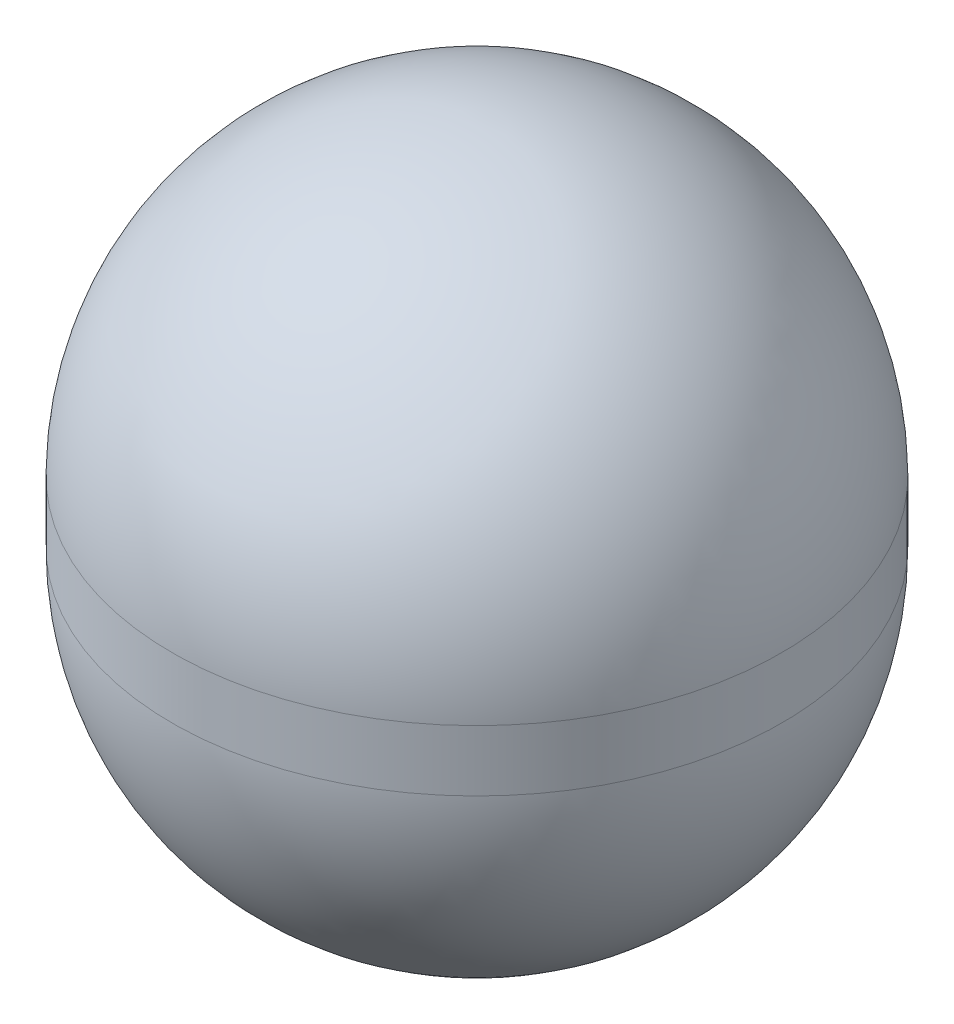
ISO-10303-21;
HEADER;
FILE_DESCRIPTION(('STEP AP214'),'2;1');
FILE_NAME('part.step','',(''),(''),'','','');
FILE_SCHEMA(('AUTOMOTIVE_DESIGN { 1 0 10303 214 1 1 1 1 }'));
ENDSEC;
DATA;
#1=APPLICATION_CONTEXT('core data for automotive mechanical design processes');
#2=APPLICATION_PROTOCOL_DEFINITION('international standard','automotive_design',2000,#1);
#3=PRODUCT_CONTEXT('',#1,'mechanical');
#4=PRODUCT('Part','Part','',(#3));
#5=PRODUCT_RELATED_PRODUCT_CATEGORY('part','',(#4));
#6=PRODUCT_DEFINITION_FORMATION('','',#4);
#7=PRODUCT_DEFINITION_CONTEXT('part definition',#1,'design');
#8=PRODUCT_DEFINITION('design','',#6,#7);
#9=PRODUCT_DEFINITION_SHAPE('','',#8);
#10=(LENGTH_UNIT() NAMED_UNIT(*) SI_UNIT(.MILLI.,.METRE.));
#11=(NAMED_UNIT(*) PLANE_ANGLE_UNIT() SI_UNIT($,.RADIAN.));
#12=(NAMED_UNIT(*) SI_UNIT($,.STERADIAN.) SOLID_ANGLE_UNIT());
#13=UNCERTAINTY_MEASURE_WITH_UNIT(LENGTH_MEASURE(1.E-05),#10,'distance_accuracy_value','');
#14=(GEOMETRIC_REPRESENTATION_CONTEXT(3) GLOBAL_UNCERTAINTY_ASSIGNED_CONTEXT((#13)) GLOBAL_UNIT_ASSIGNED_CONTEXT((#10,
#11,#12)) REPRESENTATION_CONTEXT('',''));
#15=CARTESIAN_POINT('',(0.,0.,0.));
#16=DIRECTION('',(0.,0.,1.));
#17=DIRECTION('',(1.,0.,0.));
#18=AXIS2_PLACEMENT_3D('',#15,#16,#17);
#19=CARTESIAN_POINT('',(0.,2.54,0.));
#20=DIRECTION('',(0.,-1.,0.));
#21=DIRECTION('',(1.,0.,0.));
#22=AXIS2_PLACEMENT_3D('',#19,#20,#21);
#23=CYLINDRICAL_SURFACE('',#22,12.7);
#24=CARTESIAN_POINT('',(0.,2.54,0.));
#25=DIRECTION('',(0.,1.,0.));
#26=DIRECTION('',(-1.,0.,0.));
#27=AXIS2_PLACEMENT_3D('',#24,#25,#26);
#28=CIRCLE('',#27,12.7);
#29=CARTESIAN_POINT('',(-12.7,2.54000000000009,0.));
#30=VERTEX_POINT('',#29);
#31=EDGE_CURVE('E10',#30,#30,#28,.T.);
#32=ORIENTED_EDGE('',*,*,#31,.F.);
#33=EDGE_LOOP('',(#32));
#34=FACE_BOUND('',#33,.T.);
#35=CARTESIAN_POINT('',(0.,0.,0.));
#36=DIRECTION('',(0.,1.,0.));
#37=DIRECTION('',(-1.,0.,0.));
#38=AXIS2_PLACEMENT_3D('',#35,#36,#37);
#39=CIRCLE('',#38,12.7);
#40=CARTESIAN_POINT('',(-12.7,0.,0.));
#41=VERTEX_POINT('',#40);
#42=EDGE_CURVE('E35',#41,#41,#39,.T.);
#43=ORIENTED_EDGE('',*,*,#42,.T.);
#44=EDGE_LOOP('',(#43));
#45=FACE_BOUND('',#44,.T.);
#46=ADVANCED_FACE('F31',(#34,#45),#23,.T.);
#47=CARTESIAN_POINT('',(0.,0.,0.));
#48=DIRECTION('',(0.,0.,1.));
#49=DIRECTION('',(1.,0.,0.));
#50=AXIS2_PLACEMENT_3D('',#47,#48,#49);
#51=SPHERICAL_SURFACE('',#50,12.7);
#52=CARTESIAN_POINT('',(0.,0.,0.));
#53=DIRECTION('',(0.,1.,0.));
#54=DIRECTION('',(-1.,0.,0.));
#55=AXIS2_PLACEMENT_3D('',#52,#53,#54);
#56=SPHERICAL_SURFACE('',#55,12.7);
#57=ORIENTED_EDGE('',*,*,#42,.F.);
#58=EDGE_LOOP('',(#57));
#59=FACE_BOUND('',#58,.T.);
#60=ADVANCED_FACE('F33',(#59),#56,.T.);
#61=CARTESIAN_POINT('',(0.,2.54,0.));
#62=DIRECTION('',(0.,0.,-1.));
#63=DIRECTION('',(-1.,0.,0.));
#64=AXIS2_PLACEMENT_3D('',#61,#62,#63);
#65=SPHERICAL_SURFACE('',#64,12.7);
#66=CARTESIAN_POINT('',(0.,2.54,0.));
#67=DIRECTION('',(0.,1.,0.));
#68=DIRECTION('',(-1.,0.,0.));
#69=AXIS2_PLACEMENT_3D('',#66,#67,#68);
#70=SPHERICAL_SURFACE('',#69,12.7);
#71=ORIENTED_EDGE('',*,*,#31,.T.);
#72=EDGE_LOOP('',(#71));
#73=FACE_BOUND('',#72,.T.);
#74=ADVANCED_FACE('F46',(#73),#70,.T.);
#75=CLOSED_SHELL('',(#46,#60,#74));
#76=MANIFOLD_SOLID_BREP('B2',#75);
#77=ADVANCED_BREP_SHAPE_REPRESENTATION('',(#18,#76),#14);
#78=SHAPE_DEFINITION_REPRESENTATION(#9,#77);
ENDSEC;
END-ISO-10303-21;
